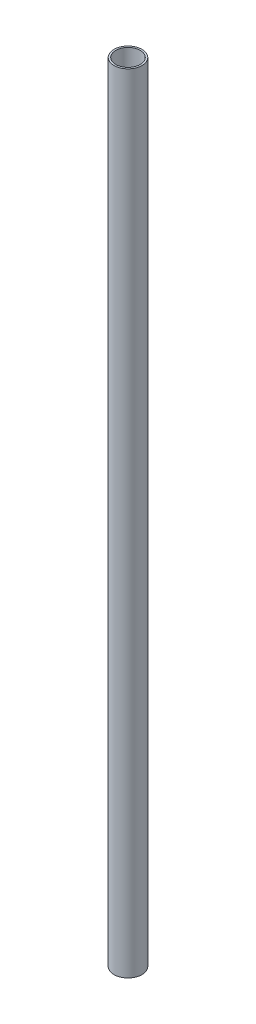
ISO-10303-21;
HEADER;
FILE_DESCRIPTION(('STEP AP214'),'2;1');
FILE_NAME('part.step','',(''),(''),'','','');
FILE_SCHEMA(('AUTOMOTIVE_DESIGN { 1 0 10303 214 1 1 1 1 }'));
ENDSEC;
DATA;
#1=APPLICATION_CONTEXT('core data for automotive mechanical design processes');
#2=APPLICATION_PROTOCOL_DEFINITION('international standard','automotive_design',2000,#1);
#3=PRODUCT_CONTEXT('',#1,'mechanical');
#4=PRODUCT('Part','Part','',(#3));
#5=PRODUCT_RELATED_PRODUCT_CATEGORY('part','',(#4));
#6=PRODUCT_DEFINITION_FORMATION('','',#4);
#7=PRODUCT_DEFINITION_CONTEXT('part definition',#1,'design');
#8=PRODUCT_DEFINITION('design','',#6,#7);
#9=PRODUCT_DEFINITION_SHAPE('','',#8);
#10=(LENGTH_UNIT() NAMED_UNIT(*) SI_UNIT(.MILLI.,.METRE.));
#11=(NAMED_UNIT(*) PLANE_ANGLE_UNIT() SI_UNIT($,.RADIAN.));
#12=(NAMED_UNIT(*) SI_UNIT($,.STERADIAN.) SOLID_ANGLE_UNIT());
#13=UNCERTAINTY_MEASURE_WITH_UNIT(LENGTH_MEASURE(1.E-05),#10,'distance_accuracy_value','');
#14=(GEOMETRIC_REPRESENTATION_CONTEXT(3) GLOBAL_UNCERTAINTY_ASSIGNED_CONTEXT((#13)) GLOBAL_UNIT_ASSIGNED_CONTEXT((#10,
#11,#12)) REPRESENTATION_CONTEXT('',''));
#15=CARTESIAN_POINT('',(0.,0.,0.));
#16=DIRECTION('',(0.,0.,1.));
#17=DIRECTION('',(1.,0.,0.));
#18=AXIS2_PLACEMENT_3D('',#15,#16,#17);
#19=CARTESIAN_POINT('',(0.,225.,0.));
#20=DIRECTION('',(0.,1.,0.));
#21=DIRECTION('',(0.,0.,1.));
#22=AXIS2_PLACEMENT_3D('',#19,#20,#21);
#23=PLANE('',#22);
#24=CARTESIAN_POINT('',(0.,225.,0.));
#25=DIRECTION('',(0.,1.,0.));
#26=DIRECTION('',(0.,0.,1.));
#27=AXIS2_PLACEMENT_3D('',#24,#25,#26);
#28=CIRCLE('',#27,4.);
#29=CARTESIAN_POINT('',(0.,225.,4.));
#30=VERTEX_POINT('',#29);
#31=EDGE_CURVE('E10',#30,#30,#28,.T.);
#32=ORIENTED_EDGE('',*,*,#31,.T.);
#33=EDGE_LOOP('',(#32));
#34=FACE_BOUND('',#33,.T.);
#35=CARTESIAN_POINT('',(0.,225.,0.));
#36=DIRECTION('',(0.,1.,0.));
#37=DIRECTION('',(0.,0.,1.));
#38=AXIS2_PLACEMENT_3D('',#35,#36,#37);
#39=CIRCLE('',#38,3.5);
#40=CARTESIAN_POINT('',(0.,225.,3.5));
#41=VERTEX_POINT('',#40);
#42=EDGE_CURVE('E50',#41,#41,#39,.T.);
#43=ORIENTED_EDGE('',*,*,#42,.F.);
#44=EDGE_LOOP('',(#43));
#45=FACE_BOUND('',#44,.T.);
#46=ADVANCED_FACE('F37',(#34,#45),#23,.T.);
#47=CARTESIAN_POINT('',(0.,0.,0.));
#48=DIRECTION('',(0.,1.,0.));
#49=DIRECTION('',(0.,0.,1.));
#50=AXIS2_PLACEMENT_3D('',#47,#48,#49);
#51=PLANE('',#50);
#52=CARTESIAN_POINT('',(0.,0.,0.));
#53=DIRECTION('',(0.,1.,0.));
#54=DIRECTION('',(0.,0.,1.));
#55=AXIS2_PLACEMENT_3D('',#52,#53,#54);
#56=CIRCLE('',#55,4.);
#57=CARTESIAN_POINT('',(0.,0.,4.));
#58=VERTEX_POINT('',#57);
#59=EDGE_CURVE('E41',#58,#58,#56,.T.);
#60=ORIENTED_EDGE('',*,*,#59,.F.);
#61=EDGE_LOOP('',(#60));
#62=FACE_BOUND('',#61,.T.);
#63=CARTESIAN_POINT('',(0.,0.,0.));
#64=DIRECTION('',(0.,1.,0.));
#65=DIRECTION('',(0.,0.,1.));
#66=AXIS2_PLACEMENT_3D('',#63,#64,#65);
#67=CIRCLE('',#66,3.5);
#68=CARTESIAN_POINT('',(0.,0.,3.5));
#69=VERTEX_POINT('',#68);
#70=EDGE_CURVE('E52',#69,#69,#67,.T.);
#71=ORIENTED_EDGE('',*,*,#70,.T.);
#72=EDGE_LOOP('',(#71));
#73=FACE_BOUND('',#72,.T.);
#74=ADVANCED_FACE('F64',(#62,#73),#51,.F.);
#75=CARTESIAN_POINT('',(0.,225.,0.));
#76=DIRECTION('',(0.,-1.,0.));
#77=DIRECTION('',(0.,0.,-1.));
#78=AXIS2_PLACEMENT_3D('',#75,#76,#77);
#79=CYLINDRICAL_SURFACE('',#78,4.);
#80=ORIENTED_EDGE('',*,*,#31,.F.);
#81=EDGE_LOOP('',(#80));
#82=FACE_BOUND('',#81,.T.);
#83=ORIENTED_EDGE('',*,*,#59,.T.);
#84=EDGE_LOOP('',(#83));
#85=FACE_BOUND('',#84,.T.);
#86=ADVANCED_FACE('F39',(#82,#85),#79,.T.);
#87=CARTESIAN_POINT('',(0.,225.,0.));
#88=DIRECTION('',(0.,-1.,0.));
#89=DIRECTION('',(0.,0.,-1.));
#90=AXIS2_PLACEMENT_3D('',#87,#88,#89);
#91=CYLINDRICAL_SURFACE('',#90,3.5);
#92=ORIENTED_EDGE('',*,*,#42,.T.);
#93=EDGE_LOOP('',(#92));
#94=FACE_BOUND('',#93,.T.);
#95=ORIENTED_EDGE('',*,*,#70,.F.);
#96=EDGE_LOOP('',(#95));
#97=FACE_BOUND('',#96,.T.);
#98=ADVANCED_FACE('F60',(#94,#97),#91,.F.);
#99=CLOSED_SHELL('',(#46,#74,#86,#98));
#100=MANIFOLD_SOLID_BREP('B2',#99);
#101=ADVANCED_BREP_SHAPE_REPRESENTATION('',(#18,#100),#14);
#102=SHAPE_DEFINITION_REPRESENTATION(#9,#101);
ENDSEC;
END-ISO-10303-21;
